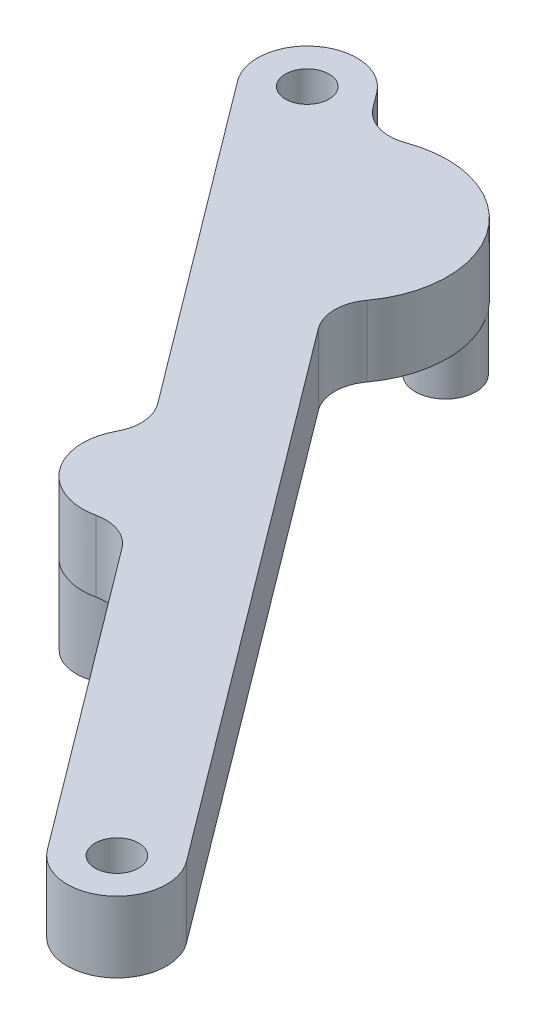
ISO-10303-21;
HEADER;
FILE_DESCRIPTION(('STEP AP214'),'2;1');
FILE_NAME('part.step','',(''),(''),'','','');
FILE_SCHEMA(('AUTOMOTIVE_DESIGN { 1 0 10303 214 1 1 1 1 }'));
ENDSEC;
DATA;
#1=APPLICATION_CONTEXT('core data for automotive mechanical design processes');
#2=APPLICATION_PROTOCOL_DEFINITION('international standard','automotive_design',2000,#1);
#3=PRODUCT_CONTEXT('',#1,'mechanical');
#4=PRODUCT('Part','Part','',(#3));
#5=PRODUCT_RELATED_PRODUCT_CATEGORY('part','',(#4));
#6=PRODUCT_DEFINITION_FORMATION('','',#4);
#7=PRODUCT_DEFINITION_CONTEXT('part definition',#1,'design');
#8=PRODUCT_DEFINITION('design','',#6,#7);
#9=PRODUCT_DEFINITION_SHAPE('','',#8);
#10=(LENGTH_UNIT() NAMED_UNIT(*) SI_UNIT(.MILLI.,.METRE.));
#11=(NAMED_UNIT(*) PLANE_ANGLE_UNIT() SI_UNIT($,.RADIAN.));
#12=(NAMED_UNIT(*) SI_UNIT($,.STERADIAN.) SOLID_ANGLE_UNIT());
#13=UNCERTAINTY_MEASURE_WITH_UNIT(LENGTH_MEASURE(1.E-05),#10,'distance_accuracy_value','');
#14=(GEOMETRIC_REPRESENTATION_CONTEXT(3) GLOBAL_UNCERTAINTY_ASSIGNED_CONTEXT((#13)) GLOBAL_UNIT_ASSIGNED_CONTEXT((#10,
#11,#12)) REPRESENTATION_CONTEXT('',''));
#15=CARTESIAN_POINT('',(0.,0.,0.));
#16=DIRECTION('',(0.,0.,1.));
#17=DIRECTION('',(1.,0.,0.));
#18=AXIS2_PLACEMENT_3D('',#15,#16,#17);
#19=CARTESIAN_POINT('',(34.6835913179539,5.2,-54.2714626076019));
#20=DIRECTION('',(0.,-1.,0.));
#21=DIRECTION('',(0.,0.,-1.));
#22=AXIS2_PLACEMENT_3D('',#19,#20,#21);
#23=CYLINDRICAL_SURFACE('',#22,3.);
#24=CARTESIAN_POINT('',(34.6835913179539,0.,-54.2714626076019));
#25=DIRECTION('',(0.,1.,0.));
#26=DIRECTION('',(0.,0.,1.));
#27=AXIS2_PLACEMENT_3D('',#24,#25,#26);
#28=CIRCLE('',#27,3.);
#29=CARTESIAN_POINT('',(32.271003193465,0.,-56.0545550173146));
#30=VERTEX_POINT('',#29);
#31=CARTESIAN_POINT('',(32.2835913179539,0.,-52.4714626076019));
#32=VERTEX_POINT('',#31);
#33=EDGE_CURVE('E161',#30,#32,#28,.T.);
#34=ORIENTED_EDGE('',*,*,#33,.F.);
#35=DIRECTION('',(0.,-1.,0.));
#36=VECTOR('',#35,1.);
#37=CARTESIAN_POINT('',(32.271003193465,5.2,-56.0545550173146));
#38=LINE('',#37,#36);
#39=CARTESIAN_POINT('',(32.271003193465,5.2,-56.0545550173146));
#40=VERTEX_POINT('',#39);
#41=EDGE_CURVE('E11',#40,#30,#38,.T.);
#42=ORIENTED_EDGE('',*,*,#41,.F.);
#43=CARTESIAN_POINT('',(34.6835913179539,5.2,-54.2714626076019));
#44=DIRECTION('',(0.,1.,0.));
#45=DIRECTION('',(0.,0.,1.));
#46=AXIS2_PLACEMENT_3D('',#43,#44,#45);
#47=CIRCLE('',#46,3.);
#48=CARTESIAN_POINT('',(32.2835913179539,5.2,-52.4714626076019));
#49=VERTEX_POINT('',#48);
#50=EDGE_CURVE('E200',#40,#49,#47,.T.);
#51=ORIENTED_EDGE('',*,*,#50,.T.);
#52=DIRECTION('',(0.,-1.,0.));
#53=VECTOR('',#52,1.);
#54=CARTESIAN_POINT('',(32.2835913179539,5.2,-52.4714626076019));
#55=LINE('',#54,#53);
#56=EDGE_CURVE('E49',#49,#32,#55,.T.);
#57=ORIENTED_EDGE('',*,*,#56,.T.);
#58=EDGE_LOOP('',(#34,#42,#51,#57));
#59=FACE_BOUND('',#58,.T.);
#60=ADVANCED_FACE('F33',(#59),#23,.F.);
#61=CARTESIAN_POINT('',(26.2696902337989,5.2,-60.4899973864751));
#62=DIRECTION('',(0.,-1.,0.));
#63=DIRECTION('',(0.,0.,-1.));
#64=AXIS2_PLACEMENT_3D('',#61,#62,#63);
#65=CYLINDRICAL_SURFACE('',#64,7.46250000000001);
#66=CARTESIAN_POINT('',(26.2696902337989,0.,-60.4899973864751));
#67=DIRECTION('',(0.,1.,0.));
#68=DIRECTION('',(0.,0.,1.));
#69=AXIS2_PLACEMENT_3D('',#66,#67,#68);
#70=CIRCLE('',#69,7.46250000000001);
#71=CARTESIAN_POINT('',(32.2396902337989,0.,-64.9674973864752));
#72=VERTEX_POINT('',#71);
#73=EDGE_CURVE('E165',#30,#72,#70,.T.);
#74=ORIENTED_EDGE('',*,*,#73,.T.);
#75=CARTESIAN_POINT('',(23.6920331881113,0.,-67.4931816911195));
#76=VERTEX_POINT('',#75);
#77=EDGE_CURVE('E163',#72,#76,#70,.T.);
#78=ORIENTED_EDGE('',*,*,#77,.T.);
#79=DIRECTION('',(0.,-1.,0.));
#80=VECTOR('',#79,1.);
#81=CARTESIAN_POINT('',(23.6920331881113,5.2,-67.4931816911195));
#82=LINE('',#81,#80);
#83=CARTESIAN_POINT('',(23.6920331881113,5.2,-67.4931816911195));
#84=VERTEX_POINT('',#83);
#85=EDGE_CURVE('E41',#84,#76,#82,.T.);
#86=ORIENTED_EDGE('',*,*,#85,.F.);
#87=CARTESIAN_POINT('',(26.2696902337989,5.2,-60.4899973864751));
#88=DIRECTION('',(0.,1.,0.));
#89=DIRECTION('',(0.,0.,1.));
#90=AXIS2_PLACEMENT_3D('',#87,#88,#89);
#91=CIRCLE('',#90,7.46250000000001);
#92=EDGE_CURVE('E245',#40,#84,#91,.T.);
#93=ORIENTED_EDGE('',*,*,#92,.F.);
#94=ORIENTED_EDGE('',*,*,#41,.T.);
#95=EDGE_LOOP('',(#74,#78,#86,#93,#94));
#96=FACE_BOUND('',#95,.T.);
#97=ADVANCED_FACE('F279',(#96),#65,.T.);
#98=CARTESIAN_POINT('',(22.655789149644,5.2,-70.3085321653484));
#99=DIRECTION('',(0.,-1.,0.));
#100=DIRECTION('',(0.,0.,-1.));
#101=AXIS2_PLACEMENT_3D('',#98,#99,#100);
#102=CYLINDRICAL_SURFACE('',#101,3.);
#103=CARTESIAN_POINT('',(22.655789149644,0.,-70.3085321653484));
#104=DIRECTION('',(0.,1.,0.));
#105=DIRECTION('',(0.,0.,1.));
#106=AXIS2_PLACEMENT_3D('',#103,#104,#105);
#107=CIRCLE('',#106,3.);
#108=CARTESIAN_POINT('',(20.255789149644,0.,-68.5085321653484));
#109=VERTEX_POINT('',#108);
#110=EDGE_CURVE('E168',#76,#109,#107,.F.);
#111=ORIENTED_EDGE('',*,*,#110,.T.);
#112=DIRECTION('',(0.,-1.,0.));
#113=VECTOR('',#112,1.);
#114=CARTESIAN_POINT('',(20.255789149644,5.2,-68.5085321653484));
#115=LINE('',#114,#113);
#116=CARTESIAN_POINT('',(20.255789149644,5.2,-68.5085321653484));
#117=VERTEX_POINT('',#116);
#118=EDGE_CURVE('E216',#117,#109,#115,.T.);
#119=ORIENTED_EDGE('',*,*,#118,.F.);
#120=CARTESIAN_POINT('',(22.655789149644,5.2,-70.3085321653484));
#121=DIRECTION('',(0.,1.,0.));
#122=DIRECTION('',(0.,0.,1.));
#123=AXIS2_PLACEMENT_3D('',#120,#121,#122);
#124=CIRCLE('',#123,3.);
#125=EDGE_CURVE('E224',#84,#117,#124,.F.);
#126=ORIENTED_EDGE('',*,*,#125,.F.);
#127=ORIENTED_EDGE('',*,*,#85,.T.);
#128=EDGE_LOOP('',(#111,#119,#126,#127));
#129=FACE_BOUND('',#128,.T.);
#130=ADVANCED_FACE('F222',(#129),#102,.F.);
#131=CARTESIAN_POINT('',(45.8478004951394,5.2,-34.3858503713547));
#132=DIRECTION('',(0.799999999999999,0.,-0.600000000000002));
#133=DIRECTION('',(-0.600000000000002,0.,-0.799999999999999));
#134=AXIS2_PLACEMENT_3D('',#131,#132,#133);
#135=PLANE('',#134);
#136=DIRECTION('',(0.600000000000002,0.,0.799999999999999));
#137=VECTOR('',#136,1.);
#138=CARTESIAN_POINT('',(45.8478004951394,0.,-34.3858503713547));
#139=LINE('',#138,#137);
#140=CARTESIAN_POINT('',(19.4116902337989,0.,-69.6339973864752));
#141=VERTEX_POINT('',#140);
#142=EDGE_CURVE('E171',#141,#109,#139,.T.);
#143=ORIENTED_EDGE('',*,*,#142,.F.);
#144=DIRECTION('',(0.,-1.,0.));
#145=VECTOR('',#144,1.);
#146=CARTESIAN_POINT('',(19.4116902337989,5.2,-69.6339973864752));
#147=LINE('',#146,#145);
#148=CARTESIAN_POINT('',(19.4116902337989,5.2,-69.6339973864752));
#149=VERTEX_POINT('',#148);
#150=EDGE_CURVE('E214',#149,#141,#147,.T.);
#151=ORIENTED_EDGE('',*,*,#150,.F.);
#152=DIRECTION('',(0.600000000000002,0.,0.799999999999999));
#153=VECTOR('',#152,1.);
#154=CARTESIAN_POINT('',(45.8478004951394,5.2,-34.3858503713547));
#155=LINE('',#154,#153);
#156=EDGE_CURVE('E240',#149,#117,#155,.T.);
#157=ORIENTED_EDGE('',*,*,#156,.T.);
#158=ORIENTED_EDGE('',*,*,#118,.T.);
#159=EDGE_LOOP('',(#143,#151,#157,#158));
#160=FACE_BOUND('',#159,.T.);
#161=ADVANCED_FACE('F236',(#160),#135,.T.);
#162=CARTESIAN_POINT('',(16.4916902337989,5.2,-67.4439973864751));
#163=DIRECTION('',(0.,-1.,0.));
#164=DIRECTION('',(0.,0.,-1.));
#165=AXIS2_PLACEMENT_3D('',#162,#163,#164);
#166=CYLINDRICAL_SURFACE('',#165,3.65000000000001);
#167=CARTESIAN_POINT('',(16.4916902337989,0.,-67.4439973864751));
#168=DIRECTION('',(0.,1.,0.));
#169=DIRECTION('',(0.,0.,1.));
#170=AXIS2_PLACEMENT_3D('',#167,#168,#169);
#171=CIRCLE('',#170,3.65000000000001);
#172=CARTESIAN_POINT('',(13.5716902337989,0.,-65.2539973864751));
#173=VERTEX_POINT('',#172);
#174=EDGE_CURVE('E174',#141,#173,#171,.T.);
#175=ORIENTED_EDGE('',*,*,#174,.T.);
#176=DIRECTION('',(0.,-1.,0.));
#177=VECTOR('',#176,1.);
#178=CARTESIAN_POINT('',(13.5716902337989,5.2,-65.2539973864751));
#179=LINE('',#178,#177);
#180=CARTESIAN_POINT('',(13.5716902337989,5.2,-65.2539973864751));
#181=VERTEX_POINT('',#180);
#182=EDGE_CURVE('E211',#181,#173,#179,.T.);
#183=ORIENTED_EDGE('',*,*,#182,.F.);
#184=CARTESIAN_POINT('',(16.4916902337989,5.2,-67.4439973864751));
#185=DIRECTION('',(0.,1.,0.));
#186=DIRECTION('',(0.,0.,1.));
#187=AXIS2_PLACEMENT_3D('',#184,#185,#186);
#188=CIRCLE('',#187,3.65000000000001);
#189=EDGE_CURVE('E241',#149,#181,#188,.T.);
#190=ORIENTED_EDGE('',*,*,#189,.F.);
#191=ORIENTED_EDGE('',*,*,#150,.T.);
#192=EDGE_LOOP('',(#175,#183,#190,#191));
#193=FACE_BOUND('',#192,.T.);
#194=ADVANCED_FACE('F290',(#193),#166,.T.);
#195=CARTESIAN_POINT('',(40.0078004951394,5.2,-30.0058503713545));
#196=DIRECTION('',(0.8,0.,-0.6));
#197=DIRECTION('',(-0.6,0.,-0.8));
#198=AXIS2_PLACEMENT_3D('',#195,#196,#197);
#199=PLANE('',#198);
#200=DIRECTION('',(0.6,0.,0.8));
#201=VECTOR('',#200,1.);
#202=CARTESIAN_POINT('',(40.0078004951394,0.,-30.0058503713545));
#203=LINE('',#202,#201);
#204=CARTESIAN_POINT('',(31.1777498593138,0.,-41.7792512191219));
#205=VERTEX_POINT('',#204);
#206=EDGE_CURVE('E176',#173,#205,#203,.T.);
#207=ORIENTED_EDGE('',*,*,#206,.T.);
#208=DIRECTION('',(0.,-1.,0.));
#209=VECTOR('',#208,1.);
#210=CARTESIAN_POINT('',(31.1777498593138,5.2,-41.7792512191219));
#211=LINE('',#210,#209);
#212=CARTESIAN_POINT('',(31.1777498593138,5.2,-41.7792512191219));
#213=VERTEX_POINT('',#212);
#214=EDGE_CURVE('E209',#213,#205,#211,.T.);
#215=ORIENTED_EDGE('',*,*,#214,.F.);
#216=DIRECTION('',(0.6,0.,0.8));
#217=VECTOR('',#216,1.);
#218=CARTESIAN_POINT('',(40.0078004951394,5.2,-30.0058503713545));
#219=LINE('',#218,#217);
#220=EDGE_CURVE('E243',#181,#213,#219,.T.);
#221=ORIENTED_EDGE('',*,*,#220,.F.);
#222=ORIENTED_EDGE('',*,*,#182,.T.);
#223=EDGE_LOOP('',(#207,#215,#221,#222));
#224=FACE_BOUND('',#223,.T.);
#225=ADVANCED_FACE('F293',(#224),#199,.F.);
#226=CARTESIAN_POINT('',(28.7777498593138,5.2,-39.9792512191219));
#227=DIRECTION('',(0.,-1.,0.));
#228=DIRECTION('',(0.,0.,-1.));
#229=AXIS2_PLACEMENT_3D('',#226,#227,#228);
#230=CYLINDRICAL_SURFACE('',#229,2.99999999999999);
#231=CARTESIAN_POINT('',(28.7777498593138,0.,-39.9792512191219));
#232=DIRECTION('',(0.,1.,0.));
#233=DIRECTION('',(0.,0.,1.));
#234=AXIS2_PLACEMENT_3D('',#231,#232,#233);
#235=CIRCLE('',#234,2.99999999999999);
#236=CARTESIAN_POINT('',(31.4139290916096,0.,-38.5472738955543));
#237=VERTEX_POINT('',#236);
#238=EDGE_CURVE('E179',#237,#205,#235,.T.);
#239=ORIENTED_EDGE('',*,*,#238,.F.);
#240=DIRECTION('',(0.,-1.,0.));
#241=VECTOR('',#240,1.);
#242=CARTESIAN_POINT('',(31.4139290916096,5.2,-38.5472738955543));
#243=LINE('',#242,#241);
#244=CARTESIAN_POINT('',(31.4139290916096,5.2,-38.5472738955543));
#245=VERTEX_POINT('',#244);
#246=EDGE_CURVE('E207',#245,#237,#243,.T.);
#247=ORIENTED_EDGE('',*,*,#246,.F.);
#248=CARTESIAN_POINT('',(28.7777498593138,5.2,-39.9792512191219));
#249=DIRECTION('',(0.,1.,0.));
#250=DIRECTION('',(0.,0.,1.));
#251=AXIS2_PLACEMENT_3D('',#248,#249,#250);
#252=CIRCLE('',#251,2.99999999999999);
#253=EDGE_CURVE('E250',#245,#213,#252,.T.);
#254=ORIENTED_EDGE('',*,*,#253,.T.);
#255=ORIENTED_EDGE('',*,*,#214,.T.);
#256=EDGE_LOOP('',(#239,#247,#254,#255));
#257=FACE_BOUND('',#256,.T.);
#258=ADVANCED_FACE('F297',(#257),#230,.F.);
#259=CARTESIAN_POINT('',(35.1058102337989,5.2,-36.5418373864752));
#260=DIRECTION('',(0.,-1.,0.));
#261=DIRECTION('',(0.,0.,-1.));
#262=AXIS2_PLACEMENT_3D('',#259,#260,#261);
#263=CYLINDRICAL_SURFACE('',#262,4.20140000000002);
#264=CARTESIAN_POINT('',(35.1058102337989,0.,-36.5418373864752));
#265=DIRECTION('',(0.,1.,0.));
#266=DIRECTION('',(0.,0.,1.));
#267=AXIS2_PLACEMENT_3D('',#264,#265,#266);
#268=CIRCLE('',#267,4.20140000000002);
#269=CARTESIAN_POINT('',(31.7446902337989,0.,-34.0209973864751));
#270=VERTEX_POINT('',#269);
#271=EDGE_CURVE('E183',#237,#270,#268,.T.);
#272=ORIENTED_EDGE('',*,*,#271,.T.);
#273=CARTESIAN_POINT('',(35.9973025627019,0.,-32.4361092674313));
#274=VERTEX_POINT('',#273);
#275=EDGE_CURVE('E182',#270,#274,#268,.T.);
#276=ORIENTED_EDGE('',*,*,#275,.T.);
#277=DIRECTION('',(0.,-1.,0.));
#278=VECTOR('',#277,1.);
#279=CARTESIAN_POINT('',(35.9973025627019,5.2,-32.4361092674313));
#280=LINE('',#279,#278);
#281=CARTESIAN_POINT('',(35.9973025627019,5.2,-32.4361092674313));
#282=VERTEX_POINT('',#281);
#283=EDGE_CURVE('E204',#282,#274,#280,.T.);
#284=ORIENTED_EDGE('',*,*,#283,.F.);
#285=CARTESIAN_POINT('',(35.1058102337989,5.2,-36.5418373864752));
#286=DIRECTION('',(0.,1.,0.));
#287=DIRECTION('',(0.,0.,1.));
#288=AXIS2_PLACEMENT_3D('',#285,#286,#287);
#289=CIRCLE('',#288,4.20140000000002);
#290=EDGE_CURVE('E253',#245,#282,#289,.T.);
#291=ORIENTED_EDGE('',*,*,#290,.F.);
#292=ORIENTED_EDGE('',*,*,#246,.T.);
#293=EDGE_LOOP('',(#272,#276,#284,#291,#292));
#294=FACE_BOUND('',#293,.T.);
#295=ADVANCED_FACE('F258',(#294),#263,.T.);
#296=CARTESIAN_POINT('',(36.633870608284,5.2,-29.5044235538283));
#297=DIRECTION('',(0.,-1.,0.));
#298=DIRECTION('',(0.,0.,-1.));
#299=AXIS2_PLACEMENT_3D('',#296,#297,#298);
#300=CYLINDRICAL_SURFACE('',#299,3.);
#301=CARTESIAN_POINT('',(36.633870608284,0.,-29.5044235538283));
#302=DIRECTION('',(0.,1.,0.));
#303=DIRECTION('',(0.,0.,1.));
#304=AXIS2_PLACEMENT_3D('',#301,#302,#303);
#305=CIRCLE('',#304,3.);
#306=CARTESIAN_POINT('',(39.033870608284,0.,-31.3044235538283));
#307=VERTEX_POINT('',#306);
#308=EDGE_CURVE('E186',#274,#307,#305,.F.);
#309=ORIENTED_EDGE('',*,*,#308,.T.);
#310=DIRECTION('',(0.,-1.,0.));
#311=VECTOR('',#310,1.);
#312=CARTESIAN_POINT('',(39.033870608284,5.2,-31.3044235538283));
#313=LINE('',#312,#311);
#314=CARTESIAN_POINT('',(39.033870608284,5.2,-31.3044235538283));
#315=VERTEX_POINT('',#314);
#316=EDGE_CURVE('E147',#315,#307,#313,.T.);
#317=ORIENTED_EDGE('',*,*,#316,.F.);
#318=CARTESIAN_POINT('',(36.633870608284,5.2,-29.5044235538283));
#319=DIRECTION('',(0.,1.,0.));
#320=DIRECTION('',(0.,0.,1.));
#321=AXIS2_PLACEMENT_3D('',#318,#319,#320);
#322=CIRCLE('',#321,3.);
#323=EDGE_CURVE('E135',#282,#315,#322,.F.);
#324=ORIENTED_EDGE('',*,*,#323,.F.);
#325=ORIENTED_EDGE('',*,*,#283,.T.);
#326=EDGE_LOOP('',(#309,#317,#324,#325));
#327=FACE_BOUND('',#326,.T.);
#328=ADVANCED_FACE('F262',(#327),#300,.F.);
#329=CARTESIAN_POINT('',(40.0078004951394,5.2,-30.0058503713545));
#330=DIRECTION('',(0.8,0.,-0.6));
#331=DIRECTION('',(-0.6,0.,-0.8));
#332=AXIS2_PLACEMENT_3D('',#329,#330,#331);
#333=PLANE('',#332);
#334=DIRECTION('',(0.6,0.,0.8));
#335=VECTOR('',#334,1.);
#336=CARTESIAN_POINT('',(40.0078004951394,0.,-30.0058503713545));
#337=LINE('',#336,#335);
#338=CARTESIAN_POINT('',(55.4816902337989,0.,-9.37399738647516));
#339=VERTEX_POINT('',#338);
#340=EDGE_CURVE('E144',#307,#339,#337,.T.);
#341=ORIENTED_EDGE('',*,*,#340,.T.);
#342=DIRECTION('',(0.,-1.,0.));
#343=VECTOR('',#342,1.);
#344=CARTESIAN_POINT('',(55.4816902337989,5.2,-9.37399738647516));
#345=LINE('',#344,#343);
#346=CARTESIAN_POINT('',(55.4816902337989,5.2,-9.37399738647516));
#347=VERTEX_POINT('',#346);
#348=EDGE_CURVE('E141',#347,#339,#345,.T.);
#349=ORIENTED_EDGE('',*,*,#348,.F.);
#350=DIRECTION('',(0.6,0.,0.8));
#351=VECTOR('',#350,1.);
#352=CARTESIAN_POINT('',(40.0078004951394,5.2,-30.0058503713545));
#353=LINE('',#352,#351);
#354=EDGE_CURVE('E126',#315,#347,#353,.T.);
#355=ORIENTED_EDGE('',*,*,#354,.F.);
#356=ORIENTED_EDGE('',*,*,#316,.T.);
#357=EDGE_LOOP('',(#341,#349,#355,#356));
#358=FACE_BOUND('',#357,.T.);
#359=ADVANCED_FACE('F142',(#358),#333,.F.);
#360=CARTESIAN_POINT('',(58.4016902337989,5.2,-11.5639973864752));
#361=DIRECTION('',(0.,-1.,0.));
#362=DIRECTION('',(0.,0.,-1.));
#363=AXIS2_PLACEMENT_3D('',#360,#361,#362);
#364=CYLINDRICAL_SURFACE('',#363,3.65000000000001);
#365=CARTESIAN_POINT('',(58.4016902337989,0.,-11.5639973864752));
#366=DIRECTION('',(0.,1.,0.));
#367=DIRECTION('',(0.,0.,1.));
#368=AXIS2_PLACEMENT_3D('',#365,#366,#367);
#369=CIRCLE('',#368,3.65000000000001);
#370=CARTESIAN_POINT('',(61.3216902337989,0.,-13.7539973864752));
#371=VERTEX_POINT('',#370);
#372=EDGE_CURVE('E189',#339,#371,#369,.T.);
#373=ORIENTED_EDGE('',*,*,#372,.T.);
#374=DIRECTION('',(0.,-1.,0.));
#375=VECTOR('',#374,1.);
#376=CARTESIAN_POINT('',(61.3216902337989,5.2,-13.7539973864752));
#377=LINE('',#376,#375);
#378=CARTESIAN_POINT('',(61.3216902337989,5.2,-13.7539973864752));
#379=VERTEX_POINT('',#378);
#380=EDGE_CURVE('E88',#379,#371,#377,.T.);
#381=ORIENTED_EDGE('',*,*,#380,.F.);
#382=CARTESIAN_POINT('',(58.4016902337989,5.2,-11.5639973864752));
#383=DIRECTION('',(0.,1.,0.));
#384=DIRECTION('',(0.,0.,1.));
#385=AXIS2_PLACEMENT_3D('',#382,#383,#384);
#386=CIRCLE('',#385,3.65000000000001);
#387=EDGE_CURVE('E133',#347,#379,#386,.T.);
#388=ORIENTED_EDGE('',*,*,#387,.F.);
#389=ORIENTED_EDGE('',*,*,#348,.T.);
#390=EDGE_LOOP('',(#373,#381,#388,#389));
#391=FACE_BOUND('',#390,.T.);
#392=ADVANCED_FACE('F149',(#391),#364,.T.);
#393=CARTESIAN_POINT('',(58.4016902337989,5.2,-11.5639973864752));
#394=DIRECTION('',(0.,-1.,0.));
#395=DIRECTION('',(0.,0.,-1.));
#396=AXIS2_PLACEMENT_3D('',#393,#394,#395);
#397=CYLINDRICAL_SURFACE('',#396,1.6);
#398=CARTESIAN_POINT('',(58.4016902337989,5.2,-11.5639973864752));
#399=DIRECTION('',(0.,1.,0.));
#400=DIRECTION('',(0.,0.,1.));
#401=AXIS2_PLACEMENT_3D('',#398,#399,#400);
#402=CIRCLE('',#401,1.6);
#403=CARTESIAN_POINT('',(58.4016902337989,5.2,-9.96399738647515));
#404=VERTEX_POINT('',#403);
#405=EDGE_CURVE('E152',#404,#404,#402,.T.);
#406=ORIENTED_EDGE('',*,*,#405,.T.);
#407=EDGE_LOOP('',(#406));
#408=FACE_BOUND('',#407,.T.);
#409=CARTESIAN_POINT('',(58.4016902337989,0.,-11.5639973864752));
#410=DIRECTION('',(0.,1.,0.));
#411=DIRECTION('',(0.,0.,1.));
#412=AXIS2_PLACEMENT_3D('',#409,#410,#411);
#413=CIRCLE('',#412,1.6);
#414=CARTESIAN_POINT('',(58.4016902337989,0.,-9.96399738647515));
#415=VERTEX_POINT('',#414);
#416=EDGE_CURVE('E194',#415,#415,#413,.T.);
#417=ORIENTED_EDGE('',*,*,#416,.F.);
#418=EDGE_LOOP('',(#417));
#419=FACE_BOUND('',#418,.T.);
#420=ADVANCED_FACE('F267',(#408,#419),#397,.F.);
#421=CARTESIAN_POINT('',(45.8478004951394,5.2,-34.3858503713546));
#422=DIRECTION('',(0.8,0.,-0.6));
#423=DIRECTION('',(-0.6,0.,-0.8));
#424=AXIS2_PLACEMENT_3D('',#421,#422,#423);
#425=PLANE('',#424);
#426=DIRECTION('',(0.6,0.,0.8));
#427=VECTOR('',#426,1.);
#428=CARTESIAN_POINT('',(45.8478004951394,0.,-34.3858503713546));
#429=LINE('',#428,#427);
#430=EDGE_CURVE('E191',#32,#371,#429,.T.);
#431=ORIENTED_EDGE('',*,*,#430,.F.);
#432=ORIENTED_EDGE('',*,*,#56,.F.);
#433=DIRECTION('',(0.6,0.,0.8));
#434=VECTOR('',#433,1.);
#435=CARTESIAN_POINT('',(45.8478004951394,5.2,-34.3858503713546));
#436=LINE('',#435,#434);
#437=EDGE_CURVE('E150',#49,#379,#436,.T.);
#438=ORIENTED_EDGE('',*,*,#437,.T.);
#439=ORIENTED_EDGE('',*,*,#380,.T.);
#440=EDGE_LOOP('',(#431,#432,#438,#439));
#441=FACE_BOUND('',#440,.T.);
#442=ADVANCED_FACE('F264',(#441),#425,.T.);
#443=CARTESIAN_POINT('',(16.4916902337989,5.2,-67.4439973864751));
#444=DIRECTION('',(0.,-1.,0.));
#445=DIRECTION('',(0.,0.,-1.));
#446=AXIS2_PLACEMENT_3D('',#443,#444,#445);
#447=CYLINDRICAL_SURFACE('',#446,1.6);
#448=CARTESIAN_POINT('',(16.4916902337989,5.2,-67.4439973864751));
#449=DIRECTION('',(0.,1.,0.));
#450=DIRECTION('',(0.,0.,1.));
#451=AXIS2_PLACEMENT_3D('',#448,#449,#450);
#452=CIRCLE('',#451,1.6);
#453=CARTESIAN_POINT('',(16.4916902337989,5.2,-65.8439973864751));
#454=VERTEX_POINT('',#453);
#455=EDGE_CURVE('E158',#454,#454,#452,.T.);
#456=ORIENTED_EDGE('',*,*,#455,.T.);
#457=EDGE_LOOP('',(#456));
#458=FACE_BOUND('',#457,.T.);
#459=CARTESIAN_POINT('',(16.4916902337989,0.,-67.4439973864751));
#460=DIRECTION('',(0.,1.,0.));
#461=DIRECTION('',(0.,0.,1.));
#462=AXIS2_PLACEMENT_3D('',#459,#460,#461);
#463=CIRCLE('',#462,1.6);
#464=CARTESIAN_POINT('',(16.4916902337989,0.,-65.8439973864751));
#465=VERTEX_POINT('',#464);
#466=EDGE_CURVE('E197',#465,#465,#463,.T.);
#467=ORIENTED_EDGE('',*,*,#466,.F.);
#468=EDGE_LOOP('',(#467));
#469=FACE_BOUND('',#468,.T.);
#470=ADVANCED_FACE('F266',(#458,#469),#447,.F.);
#471=CARTESIAN_POINT('',(0.,5.2,0.));
#472=DIRECTION('',(0.,1.,0.));
#473=DIRECTION('',(0.,0.,1.));
#474=AXIS2_PLACEMENT_3D('',#471,#472,#473);
#475=PLANE('',#474);
#476=ORIENTED_EDGE('',*,*,#50,.F.);
#477=ORIENTED_EDGE('',*,*,#92,.T.);
#478=ORIENTED_EDGE('',*,*,#125,.T.);
#479=ORIENTED_EDGE('',*,*,#156,.F.);
#480=ORIENTED_EDGE('',*,*,#189,.T.);
#481=ORIENTED_EDGE('',*,*,#220,.T.);
#482=ORIENTED_EDGE('',*,*,#253,.F.);
#483=ORIENTED_EDGE('',*,*,#290,.T.);
#484=ORIENTED_EDGE('',*,*,#323,.T.);
#485=ORIENTED_EDGE('',*,*,#354,.T.);
#486=ORIENTED_EDGE('',*,*,#387,.T.);
#487=ORIENTED_EDGE('',*,*,#437,.F.);
#488=EDGE_LOOP('',(#476,#477,#478,#479,#480,#481,#482,#483,#484,#485,#486,#487));
#489=FACE_BOUND('',#488,.T.);
#490=ORIENTED_EDGE('',*,*,#405,.F.);
#491=EDGE_LOOP('',(#490));
#492=FACE_BOUND('',#491,.T.);
#493=ORIENTED_EDGE('',*,*,#455,.F.);
#494=EDGE_LOOP('',(#493));
#495=FACE_BOUND('',#494,.T.);
#496=ADVANCED_FACE('F129',(#489,#492,#495),#475,.T.);
#497=CARTESIAN_POINT('',(0.,0.,0.));
#498=DIRECTION('',(0.,1.,0.));
#499=DIRECTION('',(0.,0.,1.));
#500=AXIS2_PLACEMENT_3D('',#497,#498,#499);
#501=PLANE('',#500);
#502=ORIENTED_EDGE('',*,*,#77,.F.);
#503=CARTESIAN_POINT('',(30.4616902337989,0.,-63.6339973864752));
#504=DIRECTION('',(0.,-1.,0.));
#505=DIRECTION('',(0.,0.,-1.));
#506=AXIS2_PLACEMENT_3D('',#503,#504,#505);
#507=CIRCLE('',#506,2.2225);
#508=EDGE_CURVE('E404',#72,#72,#507,.T.);
#509=ORIENTED_EDGE('',*,*,#508,.F.);
#510=ORIENTED_EDGE('',*,*,#73,.F.);
#511=ORIENTED_EDGE('',*,*,#33,.T.);
#512=ORIENTED_EDGE('',*,*,#430,.T.);
#513=ORIENTED_EDGE('',*,*,#372,.F.);
#514=ORIENTED_EDGE('',*,*,#340,.F.);
#515=ORIENTED_EDGE('',*,*,#308,.F.);
#516=ORIENTED_EDGE('',*,*,#275,.F.);
#517=CARTESIAN_POINT('',(34.1446902337989,0.,-35.8209973864751));
#518=DIRECTION('',(0.,-1.,0.));
#519=DIRECTION('',(0.,0.,-1.));
#520=AXIS2_PLACEMENT_3D('',#517,#518,#519);
#521=CIRCLE('',#520,3.);
#522=EDGE_CURVE('E403',#270,#270,#521,.T.);
#523=ORIENTED_EDGE('',*,*,#522,.F.);
#524=ORIENTED_EDGE('',*,*,#271,.F.);
#525=ORIENTED_EDGE('',*,*,#238,.T.);
#526=ORIENTED_EDGE('',*,*,#206,.F.);
#527=ORIENTED_EDGE('',*,*,#174,.F.);
#528=ORIENTED_EDGE('',*,*,#142,.T.);
#529=ORIENTED_EDGE('',*,*,#110,.F.);
#530=EDGE_LOOP('',(#502,#509,#510,#511,#512,#513,#514,#515,#516,#523,#524,#525,#526,#527,#528,#529));
#531=FACE_BOUND('',#530,.T.);
#532=ORIENTED_EDGE('',*,*,#416,.T.);
#533=EDGE_LOOP('',(#532));
#534=FACE_BOUND('',#533,.T.);
#535=ORIENTED_EDGE('',*,*,#466,.T.);
#536=EDGE_LOOP('',(#535));
#537=FACE_BOUND('',#536,.T.);
#538=ADVANCED_FACE('F228',(#531,#534,#537),#501,.F.);
#539=CARTESIAN_POINT('',(34.1446902337989,-6.,-35.8209973864751));
#540=DIRECTION('',(0.,1.,0.));
#541=DIRECTION('',(0.,0.,1.));
#542=AXIS2_PLACEMENT_3D('',#539,#540,#541);
#543=CYLINDRICAL_SURFACE('',#542,3.);
#544=CARTESIAN_POINT('',(34.1446902337989,-6.,-35.8209973864751));
#545=DIRECTION('',(0.,-1.,0.));
#546=DIRECTION('',(0.,0.,-1.));
#547=AXIS2_PLACEMENT_3D('',#544,#545,#546);
#548=CIRCLE('',#547,3.);
#549=CARTESIAN_POINT('',(34.1446902337989,-6.,-38.8209973864752));
#550=VERTEX_POINT('',#549);
#551=EDGE_CURVE('E164',#550,#550,#548,.T.);
#552=ORIENTED_EDGE('',*,*,#551,.F.);
#553=EDGE_LOOP('',(#552));
#554=FACE_BOUND('',#553,.T.);
#555=ORIENTED_EDGE('',*,*,#522,.T.);
#556=EDGE_LOOP('',(#555));
#557=FACE_BOUND('',#556,.T.);
#558=ADVANCED_FACE('F349',(#554,#557),#543,.T.);
#559=CARTESIAN_POINT('',(34.1446902337989,-6.,-35.8209973864751));
#560=DIRECTION('',(0.,-1.,0.));
#561=DIRECTION('',(0.,0.,-1.));
#562=AXIS2_PLACEMENT_3D('',#559,#560,#561);
#563=PLANE('',#562);
#564=ORIENTED_EDGE('',*,*,#551,.T.);
#565=EDGE_LOOP('',(#564));
#566=FACE_BOUND('',#565,.T.);
#567=ADVANCED_FACE('F354',(#566),#563,.T.);
#568=CARTESIAN_POINT('',(30.4616902337989,-4.21,-63.6339973864752));
#569=DIRECTION('',(0.,1.,0.));
#570=DIRECTION('',(0.,0.,1.));
#571=AXIS2_PLACEMENT_3D('',#568,#569,#570);
#572=CYLINDRICAL_SURFACE('',#571,2.2225);
#573=CARTESIAN_POINT('',(30.4616902337989,-4.21,-63.6339973864752));
#574=DIRECTION('',(0.,-1.,0.));
#575=DIRECTION('',(0.,0.,-1.));
#576=AXIS2_PLACEMENT_3D('',#573,#574,#575);
#577=CIRCLE('',#576,2.2225);
#578=CARTESIAN_POINT('',(30.4616902337989,-4.21,-65.8564973864752));
#579=VERTEX_POINT('',#578);
#580=EDGE_CURVE('E402',#579,#579,#577,.T.);
#581=ORIENTED_EDGE('',*,*,#580,.F.);
#582=EDGE_LOOP('',(#581));
#583=FACE_BOUND('',#582,.T.);
#584=ORIENTED_EDGE('',*,*,#508,.T.);
#585=EDGE_LOOP('',(#584));
#586=FACE_BOUND('',#585,.T.);
#587=ADVANCED_FACE('F363',(#583,#586),#572,.T.);
#588=CARTESIAN_POINT('',(30.4616902337989,-4.21,-63.6339973864752));
#589=DIRECTION('',(0.,-1.,0.));
#590=DIRECTION('',(0.,0.,-1.));
#591=AXIS2_PLACEMENT_3D('',#588,#589,#590);
#592=PLANE('',#591);
#593=ORIENTED_EDGE('',*,*,#580,.T.);
#594=EDGE_LOOP('',(#593));
#595=FACE_BOUND('',#594,.T.);
#596=ADVANCED_FACE('F386',(#595),#592,.T.);
#597=CLOSED_SHELL('',(#60,#97,#130,#161,#194,#225,#258,#295,#328,#359,#392,#420,#442,#470,#496,
#538,#558,#567,#587,#596));
#598=MANIFOLD_SOLID_BREP('B2',#597);
#599=ADVANCED_BREP_SHAPE_REPRESENTATION('',(#18,#598),#14);
#600=SHAPE_DEFINITION_REPRESENTATION(#9,#599);
ENDSEC;
END-ISO-10303-21;
